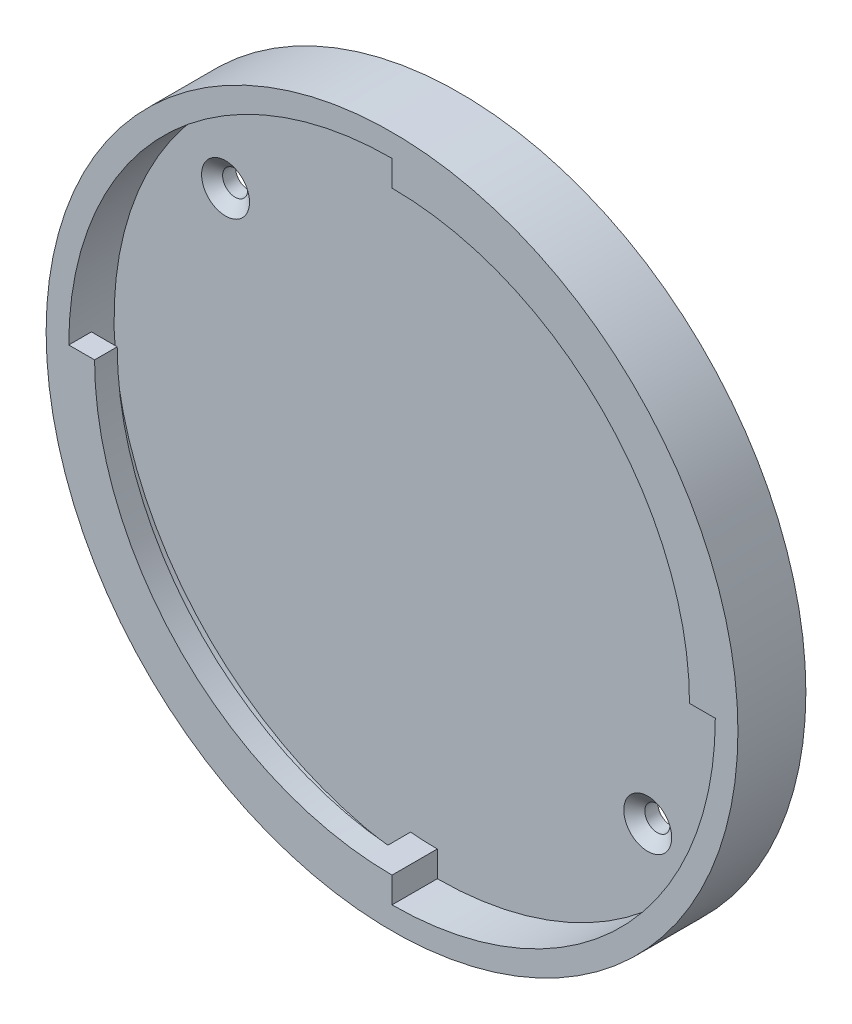
ISO-10303-21;
HEADER;
FILE_DESCRIPTION(('STEP AP214'),'2;1');
FILE_NAME('part.step','',(''),(''),'','','');
FILE_SCHEMA(('AUTOMOTIVE_DESIGN { 1 0 10303 214 1 1 1 1 }'));
ENDSEC;
DATA;
#1=APPLICATION_CONTEXT('core data for automotive mechanical design processes');
#2=APPLICATION_PROTOCOL_DEFINITION('international standard','automotive_design',2000,#1);
#3=PRODUCT_CONTEXT('',#1,'mechanical');
#4=PRODUCT('Part','Part','',(#3));
#5=PRODUCT_RELATED_PRODUCT_CATEGORY('part','',(#4));
#6=PRODUCT_DEFINITION_FORMATION('','',#4);
#7=PRODUCT_DEFINITION_CONTEXT('part definition',#1,'design');
#8=PRODUCT_DEFINITION('design','',#6,#7);
#9=PRODUCT_DEFINITION_SHAPE('','',#8);
#10=(LENGTH_UNIT() NAMED_UNIT(*) SI_UNIT(.MILLI.,.METRE.));
#11=(NAMED_UNIT(*) PLANE_ANGLE_UNIT() SI_UNIT($,.RADIAN.));
#12=(NAMED_UNIT(*) SI_UNIT($,.STERADIAN.) SOLID_ANGLE_UNIT());
#13=UNCERTAINTY_MEASURE_WITH_UNIT(LENGTH_MEASURE(1.E-05),#10,'distance_accuracy_value','');
#14=(GEOMETRIC_REPRESENTATION_CONTEXT(3) GLOBAL_UNCERTAINTY_ASSIGNED_CONTEXT((#13)) GLOBAL_UNIT_ASSIGNED_CONTEXT((#10,
#11,#12)) REPRESENTATION_CONTEXT('',''));
#15=CARTESIAN_POINT('',(0.,0.,0.));
#16=DIRECTION('',(0.,0.,1.));
#17=DIRECTION('',(1.,0.,0.));
#18=AXIS2_PLACEMENT_3D('',#15,#16,#17);
#19=CARTESIAN_POINT('',(0.,0.,7.62));
#20=DIRECTION('',(0.,0.,1.));
#21=DIRECTION('',(1.,0.,0.));
#22=AXIS2_PLACEMENT_3D('',#19,#20,#21);
#23=CYLINDRICAL_SURFACE('',#22,108.779449192);
#24=DIRECTION('',(0.,0.,-1.));
#25=VECTOR('',#24,1.);
#26=CARTESIAN_POINT('',(-9.00634276842552,-108.405970114439,20.32));
#27=LINE('',#26,#25);
#28=CARTESIAN_POINT('',(-9.00634276842552,-108.405970114439,15.24));
#29=VERTEX_POINT('',#28);
#30=CARTESIAN_POINT('',(-9.00634276842552,-108.405970114439,7.62));
#31=VERTEX_POINT('',#30);
#32=EDGE_CURVE('E260',#29,#31,#27,.T.);
#33=ORIENTED_EDGE('',*,*,#32,.T.);
#34=CARTESIAN_POINT('',(0.,0.,7.62));
#35=DIRECTION('',(0.,0.,1.));
#36=DIRECTION('',(1.,0.,0.));
#37=AXIS2_PLACEMENT_3D('',#34,#35,#36);
#38=CIRCLE('',#37,108.779449192);
#39=CARTESIAN_POINT('',(0.,108.779449192,7.62));
#40=VERTEX_POINT('',#39);
#41=EDGE_CURVE('E133',#40,#31,#38,.T.);
#42=ORIENTED_EDGE('',*,*,#41,.F.);
#43=DIRECTION('',(0.,0.,1.));
#44=VECTOR('',#43,1.);
#45=CARTESIAN_POINT('',(0.,108.779449192,10.16));
#46=LINE('',#45,#44);
#47=CARTESIAN_POINT('',(0.,108.779449192,22.86));
#48=VERTEX_POINT('',#47);
#49=EDGE_CURVE('E179',#40,#48,#46,.T.);
#50=ORIENTED_EDGE('',*,*,#49,.T.);
#51=CARTESIAN_POINT('',(0.,0.,22.86));
#52=DIRECTION('',(0.,0.,1.));
#53=DIRECTION('',(1.,0.,0.));
#54=AXIS2_PLACEMENT_3D('',#51,#52,#53);
#55=CIRCLE('',#54,108.779449192);
#56=CARTESIAN_POINT('',(-108.779449192,0.,22.86));
#57=VERTEX_POINT('',#56);
#58=EDGE_CURVE('E169',#48,#57,#55,.T.);
#59=ORIENTED_EDGE('',*,*,#58,.T.);
#60=DIRECTION('',(0.,0.,1.));
#61=VECTOR('',#60,1.);
#62=CARTESIAN_POINT('',(-108.779449192,0.,10.16));
#63=LINE('',#62,#61);
#64=CARTESIAN_POINT('',(-108.779449192,0.,15.24));
#65=VERTEX_POINT('',#64);
#66=EDGE_CURVE('E178',#65,#57,#63,.T.);
#67=ORIENTED_EDGE('',*,*,#66,.F.);
#68=CARTESIAN_POINT('',(0.,0.,15.24));
#69=DIRECTION('',(0.,0.,1.));
#70=DIRECTION('',(1.,0.,0.));
#71=AXIS2_PLACEMENT_3D('',#68,#69,#70);
#72=CIRCLE('',#71,108.779449192);
#73=EDGE_CURVE('E197',#65,#29,#72,.T.);
#74=ORIENTED_EDGE('',*,*,#73,.T.);
#75=EDGE_LOOP('',(#33,#42,#50,#59,#67,#74));
#76=FACE_BOUND('',#75,.T.);
#77=ADVANCED_FACE('F33',(#76),#23,.F.);
#78=CARTESIAN_POINT('',(0.,-108.779449192,7.62));
#79=VERTEX_POINT('',#78);
#80=CARTESIAN_POINT('',(9.0063427684255,108.405970114439,7.62));
#81=VERTEX_POINT('',#80);
#82=EDGE_CURVE('E123',#79,#81,#38,.T.);
#83=ORIENTED_EDGE('',*,*,#82,.F.);
#84=DIRECTION('',(0.,0.,1.));
#85=VECTOR('',#84,1.);
#86=CARTESIAN_POINT('',(0.,-108.779449192,10.16));
#87=LINE('',#86,#85);
#88=CARTESIAN_POINT('',(0.,-108.779449192,22.86));
#89=VERTEX_POINT('',#88);
#90=EDGE_CURVE('E167',#79,#89,#87,.T.);
#91=ORIENTED_EDGE('',*,*,#90,.T.);
#92=CARTESIAN_POINT('',(0.,0.,22.86));
#93=DIRECTION('',(0.,0.,1.));
#94=DIRECTION('',(1.,0.,0.));
#95=AXIS2_PLACEMENT_3D('',#92,#93,#94);
#96=CIRCLE('',#95,108.779449192);
#97=CARTESIAN_POINT('',(108.779449192,0.,22.86));
#98=VERTEX_POINT('',#97);
#99=EDGE_CURVE('E158',#89,#98,#96,.T.);
#100=ORIENTED_EDGE('',*,*,#99,.T.);
#101=DIRECTION('',(0.,0.,1.));
#102=VECTOR('',#101,1.);
#103=CARTESIAN_POINT('',(108.779449192,0.,10.16));
#104=LINE('',#103,#102);
#105=CARTESIAN_POINT('',(108.779449192,0.,15.24));
#106=VERTEX_POINT('',#105);
#107=EDGE_CURVE('E166',#106,#98,#104,.T.);
#108=ORIENTED_EDGE('',*,*,#107,.F.);
#109=CARTESIAN_POINT('',(9.0063427684255,108.405970114439,15.24));
#110=VERTEX_POINT('',#109);
#111=EDGE_CURVE('E141',#106,#110,#72,.T.);
#112=ORIENTED_EDGE('',*,*,#111,.T.);
#113=DIRECTION('',(0.,0.,-1.));
#114=VECTOR('',#113,1.);
#115=CARTESIAN_POINT('',(9.0063427684255,108.405970114439,20.32));
#116=LINE('',#115,#114);
#117=EDGE_CURVE('E137',#110,#81,#116,.T.);
#118=ORIENTED_EDGE('',*,*,#117,.T.);
#119=EDGE_LOOP('',(#83,#91,#100,#108,#112,#118));
#120=FACE_BOUND('',#119,.T.);
#121=ADVANCED_FACE('F138',(#120),#23,.F.);
#122=CARTESIAN_POINT('',(-108.779449192,0.,7.62));
#123=DIRECTION('',(0.,0.,-1.));
#124=DIRECTION('',(-1.,0.,0.));
#125=AXIS2_PLACEMENT_3D('',#122,#123,#124);
#126=PLANE('',#125);
#127=CARTESIAN_POINT('',(-71.2653079079652,56.7843736320382,7.62));
#128=DIRECTION('',(0.,0.,1.));
#129=DIRECTION('',(1.,0.,0.));
#130=AXIS2_PLACEMENT_3D('',#127,#128,#129);
#131=CIRCLE('',#130,8.0645);
#132=CARTESIAN_POINT('',(-63.2008079079652,56.7843736320382,7.62));
#133=VERTEX_POINT('',#132);
#134=EDGE_CURVE('E296',#133,#133,#131,.T.);
#135=ORIENTED_EDGE('',*,*,#134,.F.);
#136=EDGE_LOOP('',(#135));
#137=FACE_BOUND('',#136,.T.);
#138=CARTESIAN_POINT('',(70.8072044987154,-57.3545899739254,7.62));
#139=DIRECTION('',(0.,0.,1.));
#140=DIRECTION('',(1.,0.,0.));
#141=AXIS2_PLACEMENT_3D('',#138,#139,#140);
#142=CIRCLE('',#141,8.0645);
#143=CARTESIAN_POINT('',(78.8717044987154,-57.3545899739254,7.62));
#144=VERTEX_POINT('',#143);
#145=EDGE_CURVE('E288',#144,#144,#142,.T.);
#146=ORIENTED_EDGE('',*,*,#145,.F.);
#147=EDGE_LOOP('',(#146));
#148=FACE_BOUND('',#147,.T.);
#149=DIRECTION('',(0.,-1.,0.));
#150=VECTOR('',#149,1.);
#151=CARTESIAN_POINT('',(-9.0063427684255,-99.690897540158,7.62));
#152=LINE('',#151,#150);
#153=CARTESIAN_POINT('',(-9.0063427684255,-99.690897540158,7.62));
#154=VERTEX_POINT('',#153);
#155=EDGE_CURVE('E48',#154,#31,#152,.T.);
#156=ORIENTED_EDGE('',*,*,#155,.F.);
#157=CARTESIAN_POINT('',(0.,0.,7.62));
#158=DIRECTION('',(0.,0.,-1.));
#159=DIRECTION('',(1.,0.,0.));
#160=AXIS2_PLACEMENT_3D('',#157,#158,#159);
#161=CIRCLE('',#160,100.096899364689);
#162=CARTESIAN_POINT('',(0.,-100.096899364689,7.62));
#163=VERTEX_POINT('',#162);
#164=EDGE_CURVE('E264',#163,#154,#161,.T.);
#165=ORIENTED_EDGE('',*,*,#164,.F.);
#166=DIRECTION('',(0.,1.,0.));
#167=VECTOR('',#166,1.);
#168=CARTESIAN_POINT('',(0.,-100.096899364689,7.62));
#169=LINE('',#168,#167);
#170=EDGE_CURVE('E131',#79,#163,#169,.T.);
#171=ORIENTED_EDGE('',*,*,#170,.F.);
#172=ORIENTED_EDGE('',*,*,#82,.T.);
#173=DIRECTION('',(0.,1.,0.));
#174=VECTOR('',#173,1.);
#175=CARTESIAN_POINT('',(9.0063427684255,99.690897540158,7.62));
#176=LINE('',#175,#174);
#177=CARTESIAN_POINT('',(9.0063427684255,99.690897540158,7.62));
#178=VERTEX_POINT('',#177);
#179=EDGE_CURVE('E128',#178,#81,#176,.T.);
#180=ORIENTED_EDGE('',*,*,#179,.F.);
#181=CARTESIAN_POINT('',(0.,0.,7.62));
#182=DIRECTION('',(0.,0.,-1.));
#183=DIRECTION('',(1.,0.,0.));
#184=AXIS2_PLACEMENT_3D('',#181,#182,#183);
#185=CIRCLE('',#184,100.096899364689);
#186=CARTESIAN_POINT('',(0.,100.096899364689,7.62));
#187=VERTEX_POINT('',#186);
#188=EDGE_CURVE('E149',#187,#178,#185,.T.);
#189=ORIENTED_EDGE('',*,*,#188,.F.);
#190=DIRECTION('',(0.,-1.,0.));
#191=VECTOR('',#190,1.);
#192=CARTESIAN_POINT('',(0.,108.779449192,7.62));
#193=LINE('',#192,#191);
#194=EDGE_CURVE('E151',#40,#187,#193,.T.);
#195=ORIENTED_EDGE('',*,*,#194,.F.);
#196=ORIENTED_EDGE('',*,*,#41,.T.);
#197=EDGE_LOOP('',(#156,#165,#171,#172,#180,#189,#195,#196));
#198=FACE_BOUND('',#197,.T.);
#199=ADVANCED_FACE('F125',(#137,#148,#198),#126,.F.);
#200=CARTESIAN_POINT('',(-108.779449192,0.,15.24));
#201=DIRECTION('',(0.,0.,1.));
#202=DIRECTION('',(1.,0.,0.));
#203=AXIS2_PLACEMENT_3D('',#200,#201,#202);
#204=PLANE('',#203);
#205=DIRECTION('',(0.,1.,0.));
#206=VECTOR('',#205,1.);
#207=CARTESIAN_POINT('',(-9.0063427684255,0.,15.24));
#208=LINE('',#207,#206);
#209=CARTESIAN_POINT('',(-9.0063427684255,-99.6908975401579,15.24));
#210=VERTEX_POINT('',#209);
#211=EDGE_CURVE('E11',#29,#210,#208,.T.);
#212=ORIENTED_EDGE('',*,*,#211,.F.);
#213=ORIENTED_EDGE('',*,*,#73,.F.);
#214=DIRECTION('',(1.,0.,0.));
#215=VECTOR('',#214,1.);
#216=CARTESIAN_POINT('',(-108.779449192,0.,15.24));
#217=LINE('',#216,#215);
#218=CARTESIAN_POINT('',(-100.096899364689,0.,15.24));
#219=VERTEX_POINT('',#218);
#220=EDGE_CURVE('E181',#65,#219,#217,.T.);
#221=ORIENTED_EDGE('',*,*,#220,.T.);
#222=CARTESIAN_POINT('',(0.,0.,15.24));
#223=DIRECTION('',(0.,0.,1.));
#224=DIRECTION('',(1.,0.,0.));
#225=AXIS2_PLACEMENT_3D('',#222,#223,#224);
#226=CIRCLE('',#225,100.096899364689);
#227=EDGE_CURVE('E199',#219,#210,#226,.T.);
#228=ORIENTED_EDGE('',*,*,#227,.T.);
#229=EDGE_LOOP('',(#212,#213,#221,#228));
#230=FACE_BOUND('',#229,.T.);
#231=ADVANCED_FACE('F240',(#230),#204,.F.);
#232=DIRECTION('',(0.,-1.,0.));
#233=VECTOR('',#232,1.);
#234=CARTESIAN_POINT('',(9.0063427684255,0.,15.24));
#235=LINE('',#234,#233);
#236=CARTESIAN_POINT('',(9.0063427684255,99.6908975401579,15.24));
#237=VERTEX_POINT('',#236);
#238=EDGE_CURVE('E156',#110,#237,#235,.T.);
#239=ORIENTED_EDGE('',*,*,#238,.F.);
#240=ORIENTED_EDGE('',*,*,#111,.F.);
#241=DIRECTION('',(-1.,0.,0.));
#242=VECTOR('',#241,1.);
#243=CARTESIAN_POINT('',(-108.779449192,0.,15.24));
#244=LINE('',#243,#242);
#245=CARTESIAN_POINT('',(100.096899364689,0.,15.24));
#246=VERTEX_POINT('',#245);
#247=EDGE_CURVE('E190',#106,#246,#244,.T.);
#248=ORIENTED_EDGE('',*,*,#247,.T.);
#249=EDGE_CURVE('E200',#246,#237,#226,.T.);
#250=ORIENTED_EDGE('',*,*,#249,.T.);
#251=EDGE_LOOP('',(#239,#240,#248,#250));
#252=FACE_BOUND('',#251,.T.);
#253=ADVANCED_FACE('F224',(#252),#204,.F.);
#254=CARTESIAN_POINT('',(0.,0.,7.62));
#255=DIRECTION('',(0.,0.,1.));
#256=DIRECTION('',(1.,0.,0.));
#257=AXIS2_PLACEMENT_3D('',#254,#255,#256);
#258=CYLINDRICAL_SURFACE('',#257,100.096899364689);
#259=DIRECTION('',(0.,0.,1.));
#260=VECTOR('',#259,1.);
#261=CARTESIAN_POINT('',(0.,-100.096899364689,7.62));
#262=LINE('',#261,#260);
#263=CARTESIAN_POINT('',(0.,-100.096899364689,22.86));
#264=VERTEX_POINT('',#263);
#265=EDGE_CURVE('E56',#264,#163,#262,.F.);
#266=ORIENTED_EDGE('',*,*,#265,.T.);
#267=ORIENTED_EDGE('',*,*,#164,.T.);
#268=DIRECTION('',(0.,0.,-1.));
#269=VECTOR('',#268,1.);
#270=CARTESIAN_POINT('',(-9.0063427684255,-99.690897540158,20.32));
#271=LINE('',#270,#269);
#272=EDGE_CURVE('E262',#210,#154,#271,.T.);
#273=ORIENTED_EDGE('',*,*,#272,.F.);
#274=ORIENTED_EDGE('',*,*,#227,.F.);
#275=DIRECTION('',(0.,0.,1.));
#276=VECTOR('',#275,1.);
#277=CARTESIAN_POINT('',(-100.096899364689,0.,7.62));
#278=LINE('',#277,#276);
#279=CARTESIAN_POINT('',(-100.096899364689,0.,22.86));
#280=VERTEX_POINT('',#279);
#281=EDGE_CURVE('E185',#219,#280,#278,.T.);
#282=ORIENTED_EDGE('',*,*,#281,.T.);
#283=CARTESIAN_POINT('',(0.,0.,22.86));
#284=DIRECTION('',(0.,0.,1.));
#285=DIRECTION('',(1.,0.,0.));
#286=AXIS2_PLACEMENT_3D('',#283,#284,#285);
#287=CIRCLE('',#286,100.096899364689);
#288=EDGE_CURVE('E202',#280,#264,#287,.T.);
#289=ORIENTED_EDGE('',*,*,#288,.T.);
#290=EDGE_LOOP('',(#266,#267,#273,#274,#282,#289));
#291=FACE_BOUND('',#290,.T.);
#292=ADVANCED_FACE('F214',(#291),#258,.F.);
#293=CARTESIAN_POINT('',(0.,0.,0.));
#294=DIRECTION('',(0.,0.,1.));
#295=DIRECTION('',(1.,0.,0.));
#296=AXIS2_PLACEMENT_3D('',#293,#294,#295);
#297=PLANE('',#296);
#298=CARTESIAN_POINT('',(-71.2653079079652,56.7843736320382,0.));
#299=DIRECTION('',(0.,0.,1.));
#300=DIRECTION('',(1.,0.,0.));
#301=AXIS2_PLACEMENT_3D('',#298,#299,#300);
#302=CIRCLE('',#301,4.21639999999999);
#303=CARTESIAN_POINT('',(-67.0489079079652,56.7843736320382,0.));
#304=VERTEX_POINT('',#303);
#305=EDGE_CURVE('E291',#304,#304,#302,.T.);
#306=ORIENTED_EDGE('',*,*,#305,.T.);
#307=EDGE_LOOP('',(#306));
#308=FACE_BOUND('',#307,.T.);
#309=CARTESIAN_POINT('',(70.8072044987154,-57.3545899739254,0.));
#310=DIRECTION('',(0.,0.,1.));
#311=DIRECTION('',(1.,0.,0.));
#312=AXIS2_PLACEMENT_3D('',#309,#310,#311);
#313=CIRCLE('',#312,4.21639999999999);
#314=CARTESIAN_POINT('',(75.0236044987154,-57.3545899739254,0.));
#315=VERTEX_POINT('',#314);
#316=EDGE_CURVE('E281',#315,#315,#313,.T.);
#317=ORIENTED_EDGE('',*,*,#316,.T.);
#318=EDGE_LOOP('',(#317));
#319=FACE_BOUND('',#318,.T.);
#320=CARTESIAN_POINT('',(0.,0.,0.));
#321=DIRECTION('',(0.,0.,1.));
#322=DIRECTION('',(1.,0.,0.));
#323=AXIS2_PLACEMENT_3D('',#320,#321,#322);
#324=CIRCLE('',#323,116.399449192);
#325=CARTESIAN_POINT('',(116.399449192,0.,0.));
#326=VERTEX_POINT('',#325);
#327=EDGE_CURVE('E41',#326,#326,#324,.T.);
#328=ORIENTED_EDGE('',*,*,#327,.F.);
#329=EDGE_LOOP('',(#328));
#330=FACE_BOUND('',#329,.T.);
#331=ADVANCED_FACE('F35',(#308,#319,#330),#297,.F.);
#332=CARTESIAN_POINT('',(0.,0.,7.62));
#333=DIRECTION('',(0.,0.,1.));
#334=DIRECTION('',(1.,0.,0.));
#335=AXIS2_PLACEMENT_3D('',#332,#333,#334);
#336=CYLINDRICAL_SURFACE('',#335,116.399449192);
#337=CARTESIAN_POINT('',(0.,0.,22.86));
#338=DIRECTION('',(0.,0.,1.));
#339=DIRECTION('',(1.,0.,0.));
#340=AXIS2_PLACEMENT_3D('',#337,#338,#339);
#341=CIRCLE('',#340,116.399449192);
#342=CARTESIAN_POINT('',(116.399449192,0.,22.86));
#343=VERTEX_POINT('',#342);
#344=EDGE_CURVE('E206',#343,#343,#341,.T.);
#345=ORIENTED_EDGE('',*,*,#344,.F.);
#346=EDGE_LOOP('',(#345));
#347=FACE_BOUND('',#346,.T.);
#348=ORIENTED_EDGE('',*,*,#327,.T.);
#349=EDGE_LOOP('',(#348));
#350=FACE_BOUND('',#349,.T.);
#351=ADVANCED_FACE('F211',(#347,#350),#336,.T.);
#352=CARTESIAN_POINT('',(-109.825514225197,0.,22.86));
#353=DIRECTION('',(0.,0.,-1.));
#354=DIRECTION('',(-1.,0.,0.));
#355=AXIS2_PLACEMENT_3D('',#352,#353,#354);
#356=PLANE('',#355);
#357=ORIENTED_EDGE('',*,*,#99,.F.);
#358=DIRECTION('',(0.,-1.,0.));
#359=VECTOR('',#358,1.);
#360=CARTESIAN_POINT('',(0.,-108.779449192,22.86));
#361=LINE('',#360,#359);
#362=EDGE_CURVE('E163',#264,#89,#361,.T.);
#363=ORIENTED_EDGE('',*,*,#362,.F.);
#364=ORIENTED_EDGE('',*,*,#288,.F.);
#365=DIRECTION('',(1.,0.,0.));
#366=VECTOR('',#365,1.);
#367=CARTESIAN_POINT('',(-108.779449192,0.,22.86));
#368=LINE('',#367,#366);
#369=EDGE_CURVE('E173',#57,#280,#368,.T.);
#370=ORIENTED_EDGE('',*,*,#369,.F.);
#371=ORIENTED_EDGE('',*,*,#58,.F.);
#372=DIRECTION('',(0.,1.,0.));
#373=VECTOR('',#372,1.);
#374=CARTESIAN_POINT('',(0.,14.7699604590735,22.86));
#375=LINE('',#374,#373);
#376=CARTESIAN_POINT('',(0.,100.096899364689,22.86));
#377=VERTEX_POINT('',#376);
#378=EDGE_CURVE('E175',#377,#48,#375,.T.);
#379=ORIENTED_EDGE('',*,*,#378,.F.);
#380=CARTESIAN_POINT('',(100.096899364689,0.,22.86));
#381=VERTEX_POINT('',#380);
#382=EDGE_CURVE('E203',#381,#377,#287,.T.);
#383=ORIENTED_EDGE('',*,*,#382,.F.);
#384=DIRECTION('',(-1.,0.,0.));
#385=VECTOR('',#384,1.);
#386=CARTESIAN_POINT('',(26.6578608314845,0.,22.86));
#387=LINE('',#386,#385);
#388=EDGE_CURVE('E161',#98,#381,#387,.T.);
#389=ORIENTED_EDGE('',*,*,#388,.F.);
#390=EDGE_LOOP('',(#357,#363,#364,#370,#371,#379,#383,#389));
#391=FACE_BOUND('',#390,.T.);
#392=ORIENTED_EDGE('',*,*,#344,.T.);
#393=EDGE_LOOP('',(#392));
#394=FACE_BOUND('',#393,.T.);
#395=ADVANCED_FACE('F221',(#391,#394),#356,.F.);
#396=DIRECTION('',(0.,0.,1.));
#397=VECTOR('',#396,1.);
#398=CARTESIAN_POINT('',(0.,100.096899364689,7.62));
#399=LINE('',#398,#397);
#400=EDGE_CURVE('E188',#377,#187,#399,.F.);
#401=ORIENTED_EDGE('',*,*,#400,.T.);
#402=ORIENTED_EDGE('',*,*,#188,.T.);
#403=DIRECTION('',(0.,0.,-1.));
#404=VECTOR('',#403,1.);
#405=CARTESIAN_POINT('',(9.0063427684255,99.690897540158,20.32));
#406=LINE('',#405,#404);
#407=EDGE_CURVE('E144',#237,#178,#406,.T.);
#408=ORIENTED_EDGE('',*,*,#407,.F.);
#409=ORIENTED_EDGE('',*,*,#249,.F.);
#410=DIRECTION('',(0.,0.,1.));
#411=VECTOR('',#410,1.);
#412=CARTESIAN_POINT('',(100.096899364689,0.,7.62));
#413=LINE('',#412,#411);
#414=EDGE_CURVE('E193',#246,#381,#413,.T.);
#415=ORIENTED_EDGE('',*,*,#414,.T.);
#416=ORIENTED_EDGE('',*,*,#382,.T.);
#417=EDGE_LOOP('',(#401,#402,#408,#409,#415,#416));
#418=FACE_BOUND('',#417,.T.);
#419=ADVANCED_FACE('F226',(#418),#258,.F.);
#420=CARTESIAN_POINT('',(0.,14.7699604590735,10.16));
#421=DIRECTION('',(1.,0.,0.));
#422=DIRECTION('',(0.,1.,0.));
#423=AXIS2_PLACEMENT_3D('',#420,#421,#422);
#424=PLANE('',#423);
#425=ORIENTED_EDGE('',*,*,#378,.T.);
#426=ORIENTED_EDGE('',*,*,#49,.F.);
#427=ORIENTED_EDGE('',*,*,#194,.T.);
#428=ORIENTED_EDGE('',*,*,#400,.F.);
#429=EDGE_LOOP('',(#425,#426,#427,#428));
#430=FACE_BOUND('',#429,.T.);
#431=ADVANCED_FACE('F244',(#430),#424,.F.);
#432=CARTESIAN_POINT('',(-108.779449192,0.,10.16));
#433=DIRECTION('',(0.,-1.,0.));
#434=DIRECTION('',(1.,0.,0.));
#435=AXIS2_PLACEMENT_3D('',#432,#433,#434);
#436=PLANE('',#435);
#437=ORIENTED_EDGE('',*,*,#220,.F.);
#438=ORIENTED_EDGE('',*,*,#66,.T.);
#439=ORIENTED_EDGE('',*,*,#369,.T.);
#440=ORIENTED_EDGE('',*,*,#281,.F.);
#441=EDGE_LOOP('',(#437,#438,#439,#440));
#442=FACE_BOUND('',#441,.T.);
#443=ADVANCED_FACE('F329',(#442),#436,.F.);
#444=CARTESIAN_POINT('',(0.,-108.779449192,10.16));
#445=DIRECTION('',(-1.,0.,0.));
#446=DIRECTION('',(0.,-1.,0.));
#447=AXIS2_PLACEMENT_3D('',#444,#445,#446);
#448=PLANE('',#447);
#449=ORIENTED_EDGE('',*,*,#362,.T.);
#450=ORIENTED_EDGE('',*,*,#90,.F.);
#451=ORIENTED_EDGE('',*,*,#170,.T.);
#452=ORIENTED_EDGE('',*,*,#265,.F.);
#453=EDGE_LOOP('',(#449,#450,#451,#452));
#454=FACE_BOUND('',#453,.T.);
#455=ADVANCED_FACE('F259',(#454),#448,.F.);
#456=CARTESIAN_POINT('',(26.6578608314845,0.,10.16));
#457=DIRECTION('',(0.,1.,0.));
#458=DIRECTION('',(-1.,0.,0.));
#459=AXIS2_PLACEMENT_3D('',#456,#457,#458);
#460=PLANE('',#459);
#461=ORIENTED_EDGE('',*,*,#247,.F.);
#462=ORIENTED_EDGE('',*,*,#107,.T.);
#463=ORIENTED_EDGE('',*,*,#388,.T.);
#464=ORIENTED_EDGE('',*,*,#414,.F.);
#465=EDGE_LOOP('',(#461,#462,#463,#464));
#466=FACE_BOUND('',#465,.T.);
#467=ADVANCED_FACE('F326',(#466),#460,.F.);
#468=CARTESIAN_POINT('',(9.0063427684255,99.690897540158,20.32));
#469=DIRECTION('',(-1.,0.,0.));
#470=DIRECTION('',(0.,0.,1.));
#471=AXIS2_PLACEMENT_3D('',#468,#469,#470);
#472=PLANE('',#471);
#473=ORIENTED_EDGE('',*,*,#117,.F.);
#474=ORIENTED_EDGE('',*,*,#238,.T.);
#475=ORIENTED_EDGE('',*,*,#407,.T.);
#476=ORIENTED_EDGE('',*,*,#179,.T.);
#477=EDGE_LOOP('',(#473,#474,#475,#476));
#478=FACE_BOUND('',#477,.T.);
#479=ADVANCED_FACE('F146',(#478),#472,.F.);
#480=CARTESIAN_POINT('',(-9.0063427684255,-99.690897540158,20.32));
#481=DIRECTION('',(1.,0.,0.));
#482=DIRECTION('',(0.,0.,-1.));
#483=AXIS2_PLACEMENT_3D('',#480,#481,#482);
#484=PLANE('',#483);
#485=ORIENTED_EDGE('',*,*,#32,.F.);
#486=ORIENTED_EDGE('',*,*,#211,.T.);
#487=ORIENTED_EDGE('',*,*,#272,.T.);
#488=ORIENTED_EDGE('',*,*,#155,.T.);
#489=EDGE_LOOP('',(#485,#486,#487,#488));
#490=FACE_BOUND('',#489,.T.);
#491=ADVANCED_FACE('F278',(#490),#484,.F.);
#492=CARTESIAN_POINT('',(70.8072044987154,-57.3545899739254,7.62));
#493=DIRECTION('',(0.,0.,1.));
#494=DIRECTION('',(1.,0.,0.));
#495=AXIS2_PLACEMENT_3D('',#492,#493,#494);
#496=CYLINDRICAL_SURFACE('',#495,4.21639999999999);
#497=ORIENTED_EDGE('',*,*,#316,.F.);
#498=EDGE_LOOP('',(#497));
#499=FACE_BOUND('',#498,.T.);
#500=CARTESIAN_POINT('',(70.8072044987154,-57.3545899739254,4.3910607092667));
#501=DIRECTION('',(0.,0.,1.));
#502=DIRECTION('',(1.,0.,0.));
#503=AXIS2_PLACEMENT_3D('',#500,#501,#502);
#504=CIRCLE('',#503,4.21639999999999);
#505=CARTESIAN_POINT('',(75.0236044987154,-57.3545899739254,4.3910607092667));
#506=VERTEX_POINT('',#505);
#507=EDGE_CURVE('E283',#506,#506,#504,.T.);
#508=ORIENTED_EDGE('',*,*,#507,.T.);
#509=EDGE_LOOP('',(#508));
#510=FACE_BOUND('',#509,.T.);
#511=ADVANCED_FACE('F308',(#499,#510),#496,.F.);
#512=CARTESIAN_POINT('',(70.8072044987154,-57.3545899739254,7.62));
#513=DIRECTION('',(0.,0.,1.));
#514=DIRECTION('',(1.,0.,0.));
#515=AXIS2_PLACEMENT_3D('',#512,#513,#514);
#516=CONICAL_SURFACE('',#515,8.0645,0.872664625997165);
#517=ORIENTED_EDGE('',*,*,#507,.F.);
#518=EDGE_LOOP('',(#517));
#519=FACE_BOUND('',#518,.T.);
#520=ORIENTED_EDGE('',*,*,#145,.T.);
#521=EDGE_LOOP('',(#520));
#522=FACE_BOUND('',#521,.T.);
#523=ADVANCED_FACE('F305',(#519,#522),#516,.F.);
#524=CARTESIAN_POINT('',(-71.2653079079652,56.7843736320382,7.62));
#525=DIRECTION('',(0.,0.,1.));
#526=DIRECTION('',(1.,0.,0.));
#527=AXIS2_PLACEMENT_3D('',#524,#525,#526);
#528=CYLINDRICAL_SURFACE('',#527,4.21639999999999);
#529=ORIENTED_EDGE('',*,*,#305,.F.);
#530=EDGE_LOOP('',(#529));
#531=FACE_BOUND('',#530,.T.);
#532=CARTESIAN_POINT('',(-71.2653079079652,56.7843736320382,4.3910607092667));
#533=DIRECTION('',(0.,0.,1.));
#534=DIRECTION('',(1.,0.,0.));
#535=AXIS2_PLACEMENT_3D('',#532,#533,#534);
#536=CIRCLE('',#535,4.21639999999999);
#537=CARTESIAN_POINT('',(-67.0489079079652,56.7843736320382,4.3910607092667));
#538=VERTEX_POINT('',#537);
#539=EDGE_CURVE('E293',#538,#538,#536,.T.);
#540=ORIENTED_EDGE('',*,*,#539,.T.);
#541=EDGE_LOOP('',(#540));
#542=FACE_BOUND('',#541,.T.);
#543=ADVANCED_FACE('F307',(#531,#542),#528,.F.);
#544=CARTESIAN_POINT('',(-71.2653079079652,56.7843736320382,7.62));
#545=DIRECTION('',(0.,0.,1.));
#546=DIRECTION('',(1.,0.,0.));
#547=AXIS2_PLACEMENT_3D('',#544,#545,#546);
#548=CONICAL_SURFACE('',#547,8.0645,0.872664625997165);
#549=ORIENTED_EDGE('',*,*,#539,.F.);
#550=EDGE_LOOP('',(#549));
#551=FACE_BOUND('',#550,.T.);
#552=ORIENTED_EDGE('',*,*,#134,.T.);
#553=EDGE_LOOP('',(#552));
#554=FACE_BOUND('',#553,.T.);
#555=ADVANCED_FACE('F300',(#551,#554),#548,.F.);
#556=CLOSED_SHELL('',(#77,#121,#199,#231,#253,#292,#331,#351,#395,#419,#431,#443,#455,#467,#479,
#491,#511,#523,#543,#555));
#557=MANIFOLD_SOLID_BREP('B2',#556);
#558=ADVANCED_BREP_SHAPE_REPRESENTATION('',(#18,#557),#14);
#559=SHAPE_DEFINITION_REPRESENTATION(#9,#558);
ENDSEC;
END-ISO-10303-21;
